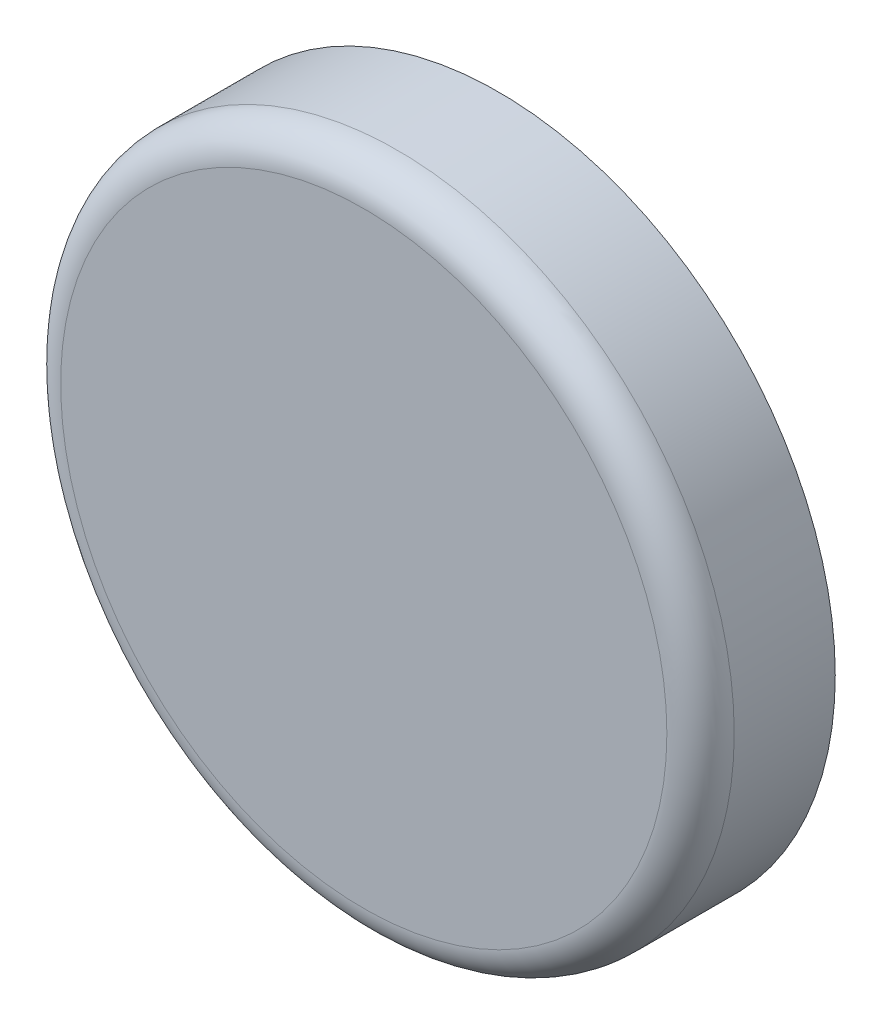
ISO-10303-21;
HEADER;
FILE_DESCRIPTION(('STEP AP214'),'2;1');
FILE_NAME('part.step','',(''),(''),'','','');
FILE_SCHEMA(('AUTOMOTIVE_DESIGN { 1 0 10303 214 1 1 1 1 }'));
ENDSEC;
DATA;
#1=APPLICATION_CONTEXT('core data for automotive mechanical design processes');
#2=APPLICATION_PROTOCOL_DEFINITION('international standard','automotive_design',2000,#1);
#3=PRODUCT_CONTEXT('',#1,'mechanical');
#4=PRODUCT('Part','Part','',(#3));
#5=PRODUCT_RELATED_PRODUCT_CATEGORY('part','',(#4));
#6=PRODUCT_DEFINITION_FORMATION('','',#4);
#7=PRODUCT_DEFINITION_CONTEXT('part definition',#1,'design');
#8=PRODUCT_DEFINITION('design','',#6,#7);
#9=PRODUCT_DEFINITION_SHAPE('','',#8);
#10=(LENGTH_UNIT() NAMED_UNIT(*) SI_UNIT(.MILLI.,.METRE.));
#11=(NAMED_UNIT(*) PLANE_ANGLE_UNIT() SI_UNIT($,.RADIAN.));
#12=(NAMED_UNIT(*) SI_UNIT($,.STERADIAN.) SOLID_ANGLE_UNIT());
#13=UNCERTAINTY_MEASURE_WITH_UNIT(LENGTH_MEASURE(1.E-05),#10,'distance_accuracy_value','');
#14=(GEOMETRIC_REPRESENTATION_CONTEXT(3) GLOBAL_UNCERTAINTY_ASSIGNED_CONTEXT((#13)) GLOBAL_UNIT_ASSIGNED_CONTEXT((#10,
#11,#12)) REPRESENTATION_CONTEXT('',''));
#15=CARTESIAN_POINT('',(0.,0.,0.));
#16=DIRECTION('',(0.,0.,1.));
#17=DIRECTION('',(1.,0.,0.));
#18=AXIS2_PLACEMENT_3D('',#15,#16,#17);
#19=CARTESIAN_POINT('',(0.,0.,1.5));
#20=DIRECTION('',(0.,0.,1.));
#21=DIRECTION('',(1.,0.,0.));
#22=AXIS2_PLACEMENT_3D('',#19,#20,#21);
#23=TOROIDAL_SURFACE('',#22,4.5,0.5);
#24=CARTESIAN_POINT('',(0.,0.,1.5));
#25=DIRECTION('',(0.,0.,1.));
#26=DIRECTION('',(1.,0.,0.));
#27=AXIS2_PLACEMENT_3D('',#24,#25,#26);
#28=CIRCLE('',#27,5.);
#29=CARTESIAN_POINT('',(5.,0.,1.5));
#30=VERTEX_POINT('',#29);
#31=EDGE_CURVE('E37',#30,#30,#28,.F.);
#32=ORIENTED_EDGE('',*,*,#31,.F.);
#33=EDGE_LOOP('',(#32));
#34=FACE_BOUND('',#33,.T.);
#35=CARTESIAN_POINT('',(0.,0.,2.));
#36=DIRECTION('',(0.,0.,1.));
#37=DIRECTION('',(1.,0.,0.));
#38=AXIS2_PLACEMENT_3D('',#35,#36,#37);
#39=CIRCLE('',#38,4.5);
#40=CARTESIAN_POINT('',(4.5,0.,2.));
#41=VERTEX_POINT('',#40);
#42=EDGE_CURVE('E10',#41,#41,#39,.T.);
#43=ORIENTED_EDGE('',*,*,#42,.F.);
#44=EDGE_LOOP('',(#43));
#45=FACE_BOUND('',#44,.T.);
#46=ADVANCED_FACE('F31',(#34,#45),#23,.T.);
#47=CARTESIAN_POINT('',(0.,0.,2.));
#48=DIRECTION('',(0.,0.,-1.));
#49=DIRECTION('',(-1.,0.,0.));
#50=AXIS2_PLACEMENT_3D('',#47,#48,#49);
#51=CYLINDRICAL_SURFACE('',#50,5.);
#52=ORIENTED_EDGE('',*,*,#31,.T.);
#53=EDGE_LOOP('',(#52));
#54=FACE_BOUND('',#53,.T.);
#55=CARTESIAN_POINT('',(0.,0.,0.));
#56=DIRECTION('',(0.,0.,1.));
#57=DIRECTION('',(1.,0.,0.));
#58=AXIS2_PLACEMENT_3D('',#55,#56,#57);
#59=CIRCLE('',#58,5.);
#60=CARTESIAN_POINT('',(5.,0.,0.));
#61=VERTEX_POINT('',#60);
#62=EDGE_CURVE('E41',#61,#61,#59,.T.);
#63=ORIENTED_EDGE('',*,*,#62,.T.);
#64=EDGE_LOOP('',(#63));
#65=FACE_BOUND('',#64,.T.);
#66=ADVANCED_FACE('F48',(#54,#65),#51,.T.);
#67=CARTESIAN_POINT('',(0.,0.,2.));
#68=DIRECTION('',(0.,0.,1.));
#69=DIRECTION('',(1.,0.,0.));
#70=AXIS2_PLACEMENT_3D('',#67,#68,#69);
#71=PLANE('',#70);
#72=ORIENTED_EDGE('',*,*,#42,.T.);
#73=EDGE_LOOP('',(#72));
#74=FACE_BOUND('',#73,.T.);
#75=ADVANCED_FACE('F52',(#74),#71,.T.);
#76=CARTESIAN_POINT('',(0.,0.,0.));
#77=DIRECTION('',(0.,0.,1.));
#78=DIRECTION('',(1.,0.,0.));
#79=AXIS2_PLACEMENT_3D('',#76,#77,#78);
#80=PLANE('',#79);
#81=ORIENTED_EDGE('',*,*,#62,.F.);
#82=EDGE_LOOP('',(#81));
#83=FACE_BOUND('',#82,.T.);
#84=ADVANCED_FACE('F50',(#83),#80,.F.);
#85=CLOSED_SHELL('',(#46,#66,#75,#84));
#86=MANIFOLD_SOLID_BREP('B2',#85);
#87=ADVANCED_BREP_SHAPE_REPRESENTATION('',(#18,#86),#14);
#88=SHAPE_DEFINITION_REPRESENTATION(#9,#87);
ENDSEC;
END-ISO-10303-21;
